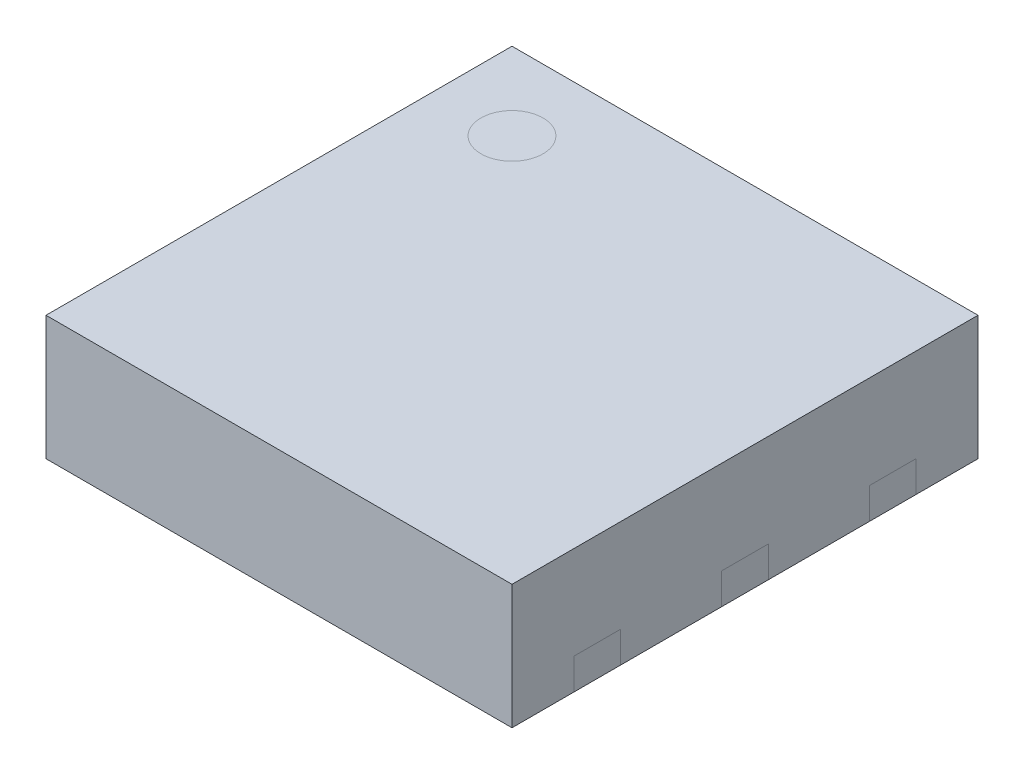
ISO-10303-21;
HEADER;
FILE_DESCRIPTION(('STEP AP214'),'2;1');
FILE_NAME('part.step','',(''),(''),'','','');
FILE_SCHEMA(('AUTOMOTIVE_DESIGN { 1 0 10303 214 1 1 1 1 }'));
ENDSEC;
DATA;
#1=APPLICATION_CONTEXT('core data for automotive mechanical design processes');
#2=APPLICATION_PROTOCOL_DEFINITION('international standard','automotive_design',2000,#1);
#3=PRODUCT_CONTEXT('',#1,'mechanical');
#4=PRODUCT('Part','Part','',(#3));
#5=PRODUCT_RELATED_PRODUCT_CATEGORY('part','',(#4));
#6=PRODUCT_DEFINITION_FORMATION('','',#4);
#7=PRODUCT_DEFINITION_CONTEXT('part definition',#1,'design');
#8=PRODUCT_DEFINITION('design','',#6,#7);
#9=PRODUCT_DEFINITION_SHAPE('','',#8);
#10=(LENGTH_UNIT() NAMED_UNIT(*) SI_UNIT(.MILLI.,.METRE.));
#11=(NAMED_UNIT(*) PLANE_ANGLE_UNIT() SI_UNIT($,.RADIAN.));
#12=(NAMED_UNIT(*) SI_UNIT($,.STERADIAN.) SOLID_ANGLE_UNIT());
#13=UNCERTAINTY_MEASURE_WITH_UNIT(LENGTH_MEASURE(1.E-05),#10,'distance_accuracy_value','');
#14=(GEOMETRIC_REPRESENTATION_CONTEXT(3) GLOBAL_UNCERTAINTY_ASSIGNED_CONTEXT((#13)) GLOBAL_UNIT_ASSIGNED_CONTEXT((#10,
#11,#12)) REPRESENTATION_CONTEXT('',''));
#15=CARTESIAN_POINT('',(0.,0.,0.));
#16=DIRECTION('',(0.,0.,1.));
#17=DIRECTION('',(1.,0.,0.));
#18=AXIS2_PLACEMENT_3D('',#15,#16,#17);
#19=CARTESIAN_POINT('',(0.,0.8,0.));
#20=DIRECTION('',(0.,1.,0.));
#21=DIRECTION('',(0.,0.,1.));
#22=AXIS2_PLACEMENT_3D('',#19,#20,#21);
#23=PLANE('',#22);
#24=DIRECTION('',(0.,0.,-1.));
#25=VECTOR('',#24,1.);
#26=CARTESIAN_POINT('',(1.5,0.8,-1.5));
#27=LINE('',#26,#25);
#28=CARTESIAN_POINT('',(1.5,0.8,1.5));
#29=VERTEX_POINT('',#28);
#30=CARTESIAN_POINT('',(1.5,0.8,-1.5));
#31=VERTEX_POINT('',#30);
#32=EDGE_CURVE('E216',#29,#31,#27,.T.);
#33=ORIENTED_EDGE('',*,*,#32,.T.);
#34=DIRECTION('',(-1.,0.,0.));
#35=VECTOR('',#34,1.);
#36=CARTESIAN_POINT('',(-1.5,0.8,-1.5));
#37=LINE('',#36,#35);
#38=CARTESIAN_POINT('',(-1.5,0.8,-1.5));
#39=VERTEX_POINT('',#38);
#40=EDGE_CURVE('E205',#31,#39,#37,.T.);
#41=ORIENTED_EDGE('',*,*,#40,.T.);
#42=DIRECTION('',(0.,0.,1.));
#43=VECTOR('',#42,1.);
#44=CARTESIAN_POINT('',(-1.5,0.8,-1.5));
#45=LINE('',#44,#43);
#46=CARTESIAN_POINT('',(-1.5,0.8,1.5));
#47=VERTEX_POINT('',#46);
#48=EDGE_CURVE('E215',#39,#47,#45,.T.);
#49=ORIENTED_EDGE('',*,*,#48,.T.);
#50=DIRECTION('',(1.,0.,0.));
#51=VECTOR('',#50,1.);
#52=CARTESIAN_POINT('',(-1.5,0.8,1.5));
#53=LINE('',#52,#51);
#54=EDGE_CURVE('E221',#47,#29,#53,.T.);
#55=ORIENTED_EDGE('',*,*,#54,.T.);
#56=EDGE_LOOP('',(#33,#41,#49,#55));
#57=FACE_BOUND('',#56,.T.);
#58=CARTESIAN_POINT('',(-1.,0.8,-1.));
#59=DIRECTION('',(0.,1.,0.));
#60=DIRECTION('',(0.,0.,1.));
#61=AXIS2_PLACEMENT_3D('',#58,#59,#60);
#62=CIRCLE('',#61,0.2);
#63=CARTESIAN_POINT('',(-1.,0.8,-0.8));
#64=VERTEX_POINT('',#63);
#65=EDGE_CURVE('E11',#64,#64,#62,.F.);
#66=ORIENTED_EDGE('',*,*,#65,.T.);
#67=EDGE_LOOP('',(#66));
#68=FACE_BOUND('',#67,.T.);
#69=ADVANCED_FACE('F43',(#57,#68),#23,.T.);
#70=CARTESIAN_POINT('',(1.5,0.8,-1.5));
#71=DIRECTION('',(-1.,0.,0.));
#72=DIRECTION('',(0.,0.,1.));
#73=AXIS2_PLACEMENT_3D('',#70,#71,#72);
#74=PLANE('',#73);
#75=DIRECTION('',(0.,-1.,0.));
#76=VECTOR('',#75,1.);
#77=CARTESIAN_POINT('',(1.5,0.8,-0.8));
#78=LINE('',#77,#76);
#79=CARTESIAN_POINT('',(1.5,0.2,-0.8));
#80=VERTEX_POINT('',#79);
#81=CARTESIAN_POINT('',(1.5,0.,-0.799999999999999));
#82=VERTEX_POINT('',#81);
#83=EDGE_CURVE('E52',#80,#82,#78,.T.);
#84=ORIENTED_EDGE('',*,*,#83,.F.);
#85=DIRECTION('',(0.,0.,1.));
#86=VECTOR('',#85,1.);
#87=CARTESIAN_POINT('',(1.5,0.2,-1.5));
#88=LINE('',#87,#86);
#89=CARTESIAN_POINT('',(1.5,0.2,-1.1));
#90=VERTEX_POINT('',#89);
#91=EDGE_CURVE('E62',#90,#80,#88,.T.);
#92=ORIENTED_EDGE('',*,*,#91,.F.);
#93=DIRECTION('',(0.,1.,0.));
#94=VECTOR('',#93,1.);
#95=CARTESIAN_POINT('',(1.5,0.8,-1.1));
#96=LINE('',#95,#94);
#97=CARTESIAN_POINT('',(1.5,0.,-1.1));
#98=VERTEX_POINT('',#97);
#99=EDGE_CURVE('E368',#98,#90,#96,.T.);
#100=ORIENTED_EDGE('',*,*,#99,.F.);
#101=DIRECTION('',(0.,0.,-1.));
#102=VECTOR('',#101,1.);
#103=CARTESIAN_POINT('',(1.5,0.,-1.5));
#104=LINE('',#103,#102);
#105=CARTESIAN_POINT('',(1.5,0.,-1.5));
#106=VERTEX_POINT('',#105);
#107=EDGE_CURVE('E229',#98,#106,#104,.T.);
#108=ORIENTED_EDGE('',*,*,#107,.T.);
#109=DIRECTION('',(0.,-1.,0.));
#110=VECTOR('',#109,1.);
#111=CARTESIAN_POINT('',(1.5,0.8,-1.5));
#112=LINE('',#111,#110);
#113=EDGE_CURVE('E209',#31,#106,#112,.T.);
#114=ORIENTED_EDGE('',*,*,#113,.F.);
#115=ORIENTED_EDGE('',*,*,#32,.F.);
#116=DIRECTION('',(0.,-1.,0.));
#117=VECTOR('',#116,1.);
#118=CARTESIAN_POINT('',(1.5,0.8,1.5));
#119=LINE('',#118,#117);
#120=CARTESIAN_POINT('',(1.5,0.,1.5));
#121=VERTEX_POINT('',#120);
#122=EDGE_CURVE('E423',#29,#121,#119,.T.);
#123=ORIENTED_EDGE('',*,*,#122,.T.);
#124=CARTESIAN_POINT('',(1.5,0.,1.1));
#125=VERTEX_POINT('',#124);
#126=EDGE_CURVE('E391',#121,#125,#104,.T.);
#127=ORIENTED_EDGE('',*,*,#126,.T.);
#128=DIRECTION('',(0.,-1.,0.));
#129=VECTOR('',#128,1.);
#130=CARTESIAN_POINT('',(1.5,0.8,1.1));
#131=LINE('',#130,#129);
#132=CARTESIAN_POINT('',(1.5,0.2,1.1));
#133=VERTEX_POINT('',#132);
#134=EDGE_CURVE('E329',#133,#125,#131,.T.);
#135=ORIENTED_EDGE('',*,*,#134,.F.);
#136=DIRECTION('',(0.,0.,1.));
#137=VECTOR('',#136,1.);
#138=CARTESIAN_POINT('',(1.5,0.199999999999999,-1.5));
#139=LINE('',#138,#137);
#140=CARTESIAN_POINT('',(1.5,0.2,0.8));
#141=VERTEX_POINT('',#140);
#142=EDGE_CURVE('E333',#141,#133,#139,.T.);
#143=ORIENTED_EDGE('',*,*,#142,.F.);
#144=DIRECTION('',(0.,1.,0.));
#145=VECTOR('',#144,1.);
#146=CARTESIAN_POINT('',(1.5,0.8,0.8));
#147=LINE('',#146,#145);
#148=CARTESIAN_POINT('',(1.5,0.,0.8));
#149=VERTEX_POINT('',#148);
#150=EDGE_CURVE('E328',#149,#141,#147,.T.);
#151=ORIENTED_EDGE('',*,*,#150,.F.);
#152=CARTESIAN_POINT('',(1.5,0.,0.15));
#153=VERTEX_POINT('',#152);
#154=EDGE_CURVE('E396',#149,#153,#104,.T.);
#155=ORIENTED_EDGE('',*,*,#154,.T.);
#156=DIRECTION('',(0.,-1.,0.));
#157=VECTOR('',#156,1.);
#158=CARTESIAN_POINT('',(1.5,0.8,0.15));
#159=LINE('',#158,#157);
#160=CARTESIAN_POINT('',(1.5,0.2,0.15));
#161=VERTEX_POINT('',#160);
#162=EDGE_CURVE('E349',#161,#153,#159,.T.);
#163=ORIENTED_EDGE('',*,*,#162,.F.);
#164=DIRECTION('',(0.,0.,1.));
#165=VECTOR('',#164,1.);
#166=CARTESIAN_POINT('',(1.5,0.2,-1.5));
#167=LINE('',#166,#165);
#168=CARTESIAN_POINT('',(1.5,0.2,-0.15));
#169=VERTEX_POINT('',#168);
#170=EDGE_CURVE('E353',#169,#161,#167,.T.);
#171=ORIENTED_EDGE('',*,*,#170,.F.);
#172=DIRECTION('',(0.,1.,0.));
#173=VECTOR('',#172,1.);
#174=CARTESIAN_POINT('',(1.5,0.8,-0.15));
#175=LINE('',#174,#173);
#176=CARTESIAN_POINT('',(1.5,0.,-0.15));
#177=VERTEX_POINT('',#176);
#178=EDGE_CURVE('E348',#177,#169,#175,.T.);
#179=ORIENTED_EDGE('',*,*,#178,.F.);
#180=EDGE_CURVE('E390',#177,#82,#104,.T.);
#181=ORIENTED_EDGE('',*,*,#180,.T.);
#182=EDGE_LOOP('',(#84,#92,#100,#108,#114,#115,#123,#127,#135,#143,#151,#155,#163,#171,#179,#181));
#183=FACE_BOUND('',#182,.T.);
#184=ADVANCED_FACE('F227',(#183),#74,.F.);
#185=CARTESIAN_POINT('',(-1.5,0.8,-1.5));
#186=DIRECTION('',(1.,0.,0.));
#187=DIRECTION('',(0.,0.,-1.));
#188=AXIS2_PLACEMENT_3D('',#185,#186,#187);
#189=PLANE('',#188);
#190=DIRECTION('',(0.,1.,0.));
#191=VECTOR('',#190,1.);
#192=CARTESIAN_POINT('',(-1.5,0.8,-0.8));
#193=LINE('',#192,#191);
#194=CARTESIAN_POINT('',(-1.5,0.,-0.8));
#195=VERTEX_POINT('',#194);
#196=CARTESIAN_POINT('',(-1.5,0.2,-0.8));
#197=VERTEX_POINT('',#196);
#198=EDGE_CURVE('E365',#195,#197,#193,.T.);
#199=ORIENTED_EDGE('',*,*,#198,.F.);
#200=DIRECTION('',(0.,0.,1.));
#201=VECTOR('',#200,1.);
#202=CARTESIAN_POINT('',(-1.5,0.,-1.5));
#203=LINE('',#202,#201);
#204=CARTESIAN_POINT('',(-1.5,0.,-0.15));
#205=VERTEX_POINT('',#204);
#206=EDGE_CURVE('E437',#195,#205,#203,.T.);
#207=ORIENTED_EDGE('',*,*,#206,.T.);
#208=DIRECTION('',(0.,-1.,0.));
#209=VECTOR('',#208,1.);
#210=CARTESIAN_POINT('',(-1.5,0.8,-0.15));
#211=LINE('',#210,#209);
#212=CARTESIAN_POINT('',(-1.5,0.2,-0.15));
#213=VERTEX_POINT('',#212);
#214=EDGE_CURVE('E332',#213,#205,#211,.T.);
#215=ORIENTED_EDGE('',*,*,#214,.F.);
#216=DIRECTION('',(0.,0.,-1.));
#217=VECTOR('',#216,1.);
#218=CARTESIAN_POINT('',(-1.5,0.2,-1.5));
#219=LINE('',#218,#217);
#220=CARTESIAN_POINT('',(-1.5,0.2,0.15));
#221=VERTEX_POINT('',#220);
#222=EDGE_CURVE('E342',#221,#213,#219,.T.);
#223=ORIENTED_EDGE('',*,*,#222,.F.);
#224=DIRECTION('',(0.,1.,0.));
#225=VECTOR('',#224,1.);
#226=CARTESIAN_POINT('',(-1.5,0.8,0.15));
#227=LINE('',#226,#225);
#228=CARTESIAN_POINT('',(-1.5,0.,0.15));
#229=VERTEX_POINT('',#228);
#230=EDGE_CURVE('E345',#229,#221,#227,.T.);
#231=ORIENTED_EDGE('',*,*,#230,.F.);
#232=CARTESIAN_POINT('',(-1.5,0.,0.8));
#233=VERTEX_POINT('',#232);
#234=EDGE_CURVE('E447',#229,#233,#203,.T.);
#235=ORIENTED_EDGE('',*,*,#234,.T.);
#236=DIRECTION('',(0.,-1.,0.));
#237=VECTOR('',#236,1.);
#238=CARTESIAN_POINT('',(-1.5,0.8,0.8));
#239=LINE('',#238,#237);
#240=CARTESIAN_POINT('',(-1.5,0.2,0.8));
#241=VERTEX_POINT('',#240);
#242=EDGE_CURVE('E313',#241,#233,#239,.T.);
#243=ORIENTED_EDGE('',*,*,#242,.F.);
#244=DIRECTION('',(0.,0.,-1.));
#245=VECTOR('',#244,1.);
#246=CARTESIAN_POINT('',(-1.5,0.199999999999999,-1.5));
#247=LINE('',#246,#245);
#248=CARTESIAN_POINT('',(-1.5,0.2,1.1));
#249=VERTEX_POINT('',#248);
#250=EDGE_CURVE('E322',#249,#241,#247,.T.);
#251=ORIENTED_EDGE('',*,*,#250,.F.);
#252=DIRECTION('',(0.,1.,0.));
#253=VECTOR('',#252,1.);
#254=CARTESIAN_POINT('',(-1.5,0.8,1.1));
#255=LINE('',#254,#253);
#256=CARTESIAN_POINT('',(-1.5,0.,1.1));
#257=VERTEX_POINT('',#256);
#258=EDGE_CURVE('E325',#257,#249,#255,.T.);
#259=ORIENTED_EDGE('',*,*,#258,.F.);
#260=CARTESIAN_POINT('',(-1.5,0.,1.5));
#261=VERTEX_POINT('',#260);
#262=EDGE_CURVE('E440',#257,#261,#203,.T.);
#263=ORIENTED_EDGE('',*,*,#262,.T.);
#264=DIRECTION('',(0.,-1.,0.));
#265=VECTOR('',#264,1.);
#266=CARTESIAN_POINT('',(-1.5,0.8,1.5));
#267=LINE('',#266,#265);
#268=EDGE_CURVE('E239',#47,#261,#267,.T.);
#269=ORIENTED_EDGE('',*,*,#268,.F.);
#270=ORIENTED_EDGE('',*,*,#48,.F.);
#271=DIRECTION('',(0.,-1.,0.));
#272=VECTOR('',#271,1.);
#273=CARTESIAN_POINT('',(-1.5,0.8,-1.5));
#274=LINE('',#273,#272);
#275=CARTESIAN_POINT('',(-1.5,0.,-1.5));
#276=VERTEX_POINT('',#275);
#277=EDGE_CURVE('E211',#39,#276,#274,.T.);
#278=ORIENTED_EDGE('',*,*,#277,.T.);
#279=CARTESIAN_POINT('',(-1.5,0.,-1.1));
#280=VERTEX_POINT('',#279);
#281=EDGE_CURVE('E433',#276,#280,#203,.T.);
#282=ORIENTED_EDGE('',*,*,#281,.T.);
#283=DIRECTION('',(0.,-1.,0.));
#284=VECTOR('',#283,1.);
#285=CARTESIAN_POINT('',(-1.5,0.8,-1.1));
#286=LINE('',#285,#284);
#287=CARTESIAN_POINT('',(-1.5,0.2,-1.1));
#288=VERTEX_POINT('',#287);
#289=EDGE_CURVE('E352',#288,#280,#286,.T.);
#290=ORIENTED_EDGE('',*,*,#289,.F.);
#291=DIRECTION('',(0.,0.,-1.));
#292=VECTOR('',#291,1.);
#293=CARTESIAN_POINT('',(-1.5,0.2,-1.5));
#294=LINE('',#293,#292);
#295=EDGE_CURVE('E362',#197,#288,#294,.T.);
#296=ORIENTED_EDGE('',*,*,#295,.F.);
#297=EDGE_LOOP('',(#199,#207,#215,#223,#231,#235,#243,#251,#259,#263,#269,#270,#278,#282,#290,#296));
#298=FACE_BOUND('',#297,.T.);
#299=ADVANCED_FACE('F472',(#298),#189,.F.);
#300=ORIENTED_EDGE('',*,*,#91,.T.);
#301=ORIENTED_EDGE('',*,*,#83,.T.);
#302=EDGE_CURVE('E378',#82,#98,#104,.T.);
#303=ORIENTED_EDGE('',*,*,#302,.T.);
#304=ORIENTED_EDGE('',*,*,#99,.T.);
#305=EDGE_LOOP('',(#300,#301,#303,#304));
#306=FACE_BOUND('',#305,.T.);
#307=ADVANCED_FACE('F376',(#306),#74,.F.);
#308=EDGE_CURVE('E436',#280,#195,#203,.T.);
#309=ORIENTED_EDGE('',*,*,#308,.T.);
#310=ORIENTED_EDGE('',*,*,#198,.T.);
#311=ORIENTED_EDGE('',*,*,#295,.T.);
#312=ORIENTED_EDGE('',*,*,#289,.T.);
#313=EDGE_LOOP('',(#309,#310,#311,#312));
#314=FACE_BOUND('',#313,.T.);
#315=ADVANCED_FACE('F463',(#314),#189,.F.);
#316=ORIENTED_EDGE('',*,*,#170,.T.);
#317=ORIENTED_EDGE('',*,*,#162,.T.);
#318=EDGE_CURVE('E402',#153,#177,#104,.T.);
#319=ORIENTED_EDGE('',*,*,#318,.T.);
#320=ORIENTED_EDGE('',*,*,#178,.T.);
#321=EDGE_LOOP('',(#316,#317,#319,#320));
#322=FACE_BOUND('',#321,.T.);
#323=ADVANCED_FACE('F498',(#322),#74,.F.);
#324=EDGE_CURVE('E442',#205,#229,#203,.T.);
#325=ORIENTED_EDGE('',*,*,#324,.T.);
#326=ORIENTED_EDGE('',*,*,#230,.T.);
#327=ORIENTED_EDGE('',*,*,#222,.T.);
#328=ORIENTED_EDGE('',*,*,#214,.T.);
#329=EDGE_LOOP('',(#325,#326,#327,#328));
#330=FACE_BOUND('',#329,.T.);
#331=ADVANCED_FACE('F477',(#330),#189,.F.);
#332=CARTESIAN_POINT('',(0.,0.,0.));
#333=DIRECTION('',(0.,1.,0.));
#334=DIRECTION('',(0.,0.,1.));
#335=AXIS2_PLACEMENT_3D('',#332,#333,#334);
#336=PLANE('',#335);
#337=DIRECTION('',(0.,0.,1.));
#338=VECTOR('',#337,1.);
#339=CARTESIAN_POINT('',(0.85,0.,0.));
#340=LINE('',#339,#338);
#341=CARTESIAN_POINT('',(0.85,0.,-1.25));
#342=VERTEX_POINT('',#341);
#343=CARTESIAN_POINT('',(0.85,0.,1.25));
#344=VERTEX_POINT('',#343);
#345=EDGE_CURVE('E251',#342,#344,#340,.T.);
#346=ORIENTED_EDGE('',*,*,#345,.F.);
#347=DIRECTION('',(1.,0.,0.));
#348=VECTOR('',#347,1.);
#349=CARTESIAN_POINT('',(0.,0.,-1.25));
#350=LINE('',#349,#348);
#351=CARTESIAN_POINT('',(-0.5,0.,-1.25));
#352=VERTEX_POINT('',#351);
#353=EDGE_CURVE('E232',#352,#342,#350,.T.);
#354=ORIENTED_EDGE('',*,*,#353,.F.);
#355=DIRECTION('',(0.707106781186551,0.,-0.707106781186544));
#356=VECTOR('',#355,1.);
#357=CARTESIAN_POINT('',(-0.874999999999997,0.,-0.875000000000007));
#358=LINE('',#357,#356);
#359=CARTESIAN_POINT('',(-0.85,0.,-0.900000000000003));
#360=VERTEX_POINT('',#359);
#361=EDGE_CURVE('E237',#360,#352,#358,.T.);
#362=ORIENTED_EDGE('',*,*,#361,.F.);
#363=DIRECTION('',(0.,0.,-1.));
#364=VECTOR('',#363,1.);
#365=CARTESIAN_POINT('',(-0.85,0.,0.));
#366=LINE('',#365,#364);
#367=CARTESIAN_POINT('',(-0.85,0.,1.25));
#368=VERTEX_POINT('',#367);
#369=EDGE_CURVE('E245',#368,#360,#366,.T.);
#370=ORIENTED_EDGE('',*,*,#369,.F.);
#371=DIRECTION('',(-1.,0.,0.));
#372=VECTOR('',#371,1.);
#373=CARTESIAN_POINT('',(0.,0.,1.25));
#374=LINE('',#373,#372);
#375=EDGE_CURVE('E248',#344,#368,#374,.T.);
#376=ORIENTED_EDGE('',*,*,#375,.F.);
#377=EDGE_LOOP('',(#346,#354,#362,#370,#376));
#378=FACE_BOUND('',#377,.T.);
#379=DIRECTION('',(1.,0.,0.));
#380=VECTOR('',#379,1.);
#381=CARTESIAN_POINT('',(0.,0.,0.8));
#382=LINE('',#381,#380);
#383=CARTESIAN_POINT('',(1.,0.,0.8));
#384=VERTEX_POINT('',#383);
#385=EDGE_CURVE('E309',#384,#149,#382,.T.);
#386=ORIENTED_EDGE('',*,*,#385,.F.);
#387=DIRECTION('',(0.,0.,-1.));
#388=VECTOR('',#387,1.);
#389=CARTESIAN_POINT('',(1.,0.,0.));
#390=LINE('',#389,#388);
#391=CARTESIAN_POINT('',(1.,0.,1.1));
#392=VERTEX_POINT('',#391);
#393=EDGE_CURVE('E308',#392,#384,#390,.T.);
#394=ORIENTED_EDGE('',*,*,#393,.F.);
#395=DIRECTION('',(-1.,0.,0.));
#396=VECTOR('',#395,1.);
#397=CARTESIAN_POINT('',(0.,0.,1.1));
#398=LINE('',#397,#396);
#399=EDGE_CURVE('E314',#125,#392,#398,.T.);
#400=ORIENTED_EDGE('',*,*,#399,.F.);
#401=ORIENTED_EDGE('',*,*,#126,.F.);
#402=DIRECTION('',(1.,0.,0.));
#403=VECTOR('',#402,1.);
#404=CARTESIAN_POINT('',(-1.5,0.,1.5));
#405=LINE('',#404,#403);
#406=EDGE_CURVE('E225',#261,#121,#405,.T.);
#407=ORIENTED_EDGE('',*,*,#406,.F.);
#408=ORIENTED_EDGE('',*,*,#262,.F.);
#409=DIRECTION('',(-1.,0.,0.));
#410=VECTOR('',#409,1.);
#411=CARTESIAN_POINT('',(0.,0.,1.1));
#412=LINE('',#411,#410);
#413=CARTESIAN_POINT('',(-1.,0.,1.1));
#414=VERTEX_POINT('',#413);
#415=EDGE_CURVE('E262',#414,#257,#412,.T.);
#416=ORIENTED_EDGE('',*,*,#415,.F.);
#417=DIRECTION('',(0.,0.,1.));
#418=VECTOR('',#417,1.);
#419=CARTESIAN_POINT('',(-1.,0.,0.));
#420=LINE('',#419,#418);
#421=CARTESIAN_POINT('',(-1.,0.,0.8));
#422=VERTEX_POINT('',#421);
#423=EDGE_CURVE('E258',#422,#414,#420,.T.);
#424=ORIENTED_EDGE('',*,*,#423,.F.);
#425=DIRECTION('',(1.,0.,0.));
#426=VECTOR('',#425,1.);
#427=CARTESIAN_POINT('',(0.,0.,0.8));
#428=LINE('',#427,#426);
#429=EDGE_CURVE('E254',#233,#422,#428,.T.);
#430=ORIENTED_EDGE('',*,*,#429,.F.);
#431=ORIENTED_EDGE('',*,*,#234,.F.);
#432=DIRECTION('',(-1.,0.,0.));
#433=VECTOR('',#432,1.);
#434=CARTESIAN_POINT('',(0.,0.,0.15));
#435=LINE('',#434,#433);
#436=CARTESIAN_POINT('',(-1.,0.,0.15));
#437=VERTEX_POINT('',#436);
#438=EDGE_CURVE('E266',#437,#229,#435,.T.);
#439=ORIENTED_EDGE('',*,*,#438,.F.);
#440=DIRECTION('',(0.,0.,1.));
#441=VECTOR('',#440,1.);
#442=CARTESIAN_POINT('',(-1.,0.,0.));
#443=LINE('',#442,#441);
#444=CARTESIAN_POINT('',(-1.,0.,-0.15));
#445=VERTEX_POINT('',#444);
#446=EDGE_CURVE('E270',#445,#437,#443,.T.);
#447=ORIENTED_EDGE('',*,*,#446,.F.);
#448=DIRECTION('',(1.,0.,0.));
#449=VECTOR('',#448,1.);
#450=CARTESIAN_POINT('',(0.,0.,-0.15));
#451=LINE('',#450,#449);
#452=EDGE_CURVE('E273',#205,#445,#451,.T.);
#453=ORIENTED_EDGE('',*,*,#452,.F.);
#454=ORIENTED_EDGE('',*,*,#206,.F.);
#455=DIRECTION('',(-1.,0.,0.));
#456=VECTOR('',#455,1.);
#457=CARTESIAN_POINT('',(0.,0.,-0.8));
#458=LINE('',#457,#456);
#459=CARTESIAN_POINT('',(-1.,0.,-0.8));
#460=VERTEX_POINT('',#459);
#461=EDGE_CURVE('E276',#460,#195,#458,.T.);
#462=ORIENTED_EDGE('',*,*,#461,.F.);
#463=DIRECTION('',(0.,0.,1.));
#464=VECTOR('',#463,1.);
#465=CARTESIAN_POINT('',(-1.,0.,0.));
#466=LINE('',#465,#464);
#467=CARTESIAN_POINT('',(-1.,0.,-1.1));
#468=VERTEX_POINT('',#467);
#469=EDGE_CURVE('E280',#468,#460,#466,.T.);
#470=ORIENTED_EDGE('',*,*,#469,.F.);
#471=DIRECTION('',(1.,0.,0.));
#472=VECTOR('',#471,1.);
#473=CARTESIAN_POINT('',(0.,0.,-1.1));
#474=LINE('',#473,#472);
#475=EDGE_CURVE('E283',#280,#468,#474,.T.);
#476=ORIENTED_EDGE('',*,*,#475,.F.);
#477=ORIENTED_EDGE('',*,*,#281,.F.);
#478=DIRECTION('',(-1.,0.,0.));
#479=VECTOR('',#478,1.);
#480=CARTESIAN_POINT('',(-1.5,0.,-1.5));
#481=LINE('',#480,#479);
#482=EDGE_CURVE('E385',#106,#276,#481,.T.);
#483=ORIENTED_EDGE('',*,*,#482,.F.);
#484=ORIENTED_EDGE('',*,*,#107,.F.);
#485=DIRECTION('',(1.,0.,0.));
#486=VECTOR('',#485,1.);
#487=CARTESIAN_POINT('',(0.,0.,-1.1));
#488=LINE('',#487,#486);
#489=CARTESIAN_POINT('',(0.999999999999999,0.,-1.1));
#490=VERTEX_POINT('',#489);
#491=EDGE_CURVE('E304',#490,#98,#488,.T.);
#492=ORIENTED_EDGE('',*,*,#491,.F.);
#493=DIRECTION('',(0.,0.,-1.));
#494=VECTOR('',#493,1.);
#495=CARTESIAN_POINT('',(0.999999999999999,0.,0.));
#496=LINE('',#495,#494);
#497=CARTESIAN_POINT('',(0.999999999999999,0.,-0.799999999999999));
#498=VERTEX_POINT('',#497);
#499=EDGE_CURVE('E297',#498,#490,#496,.T.);
#500=ORIENTED_EDGE('',*,*,#499,.F.);
#501=DIRECTION('',(-1.,0.,0.));
#502=VECTOR('',#501,1.);
#503=CARTESIAN_POINT('',(0.,0.,-0.799999999999999));
#504=LINE('',#503,#502);
#505=EDGE_CURVE('E301',#82,#498,#504,.T.);
#506=ORIENTED_EDGE('',*,*,#505,.F.);
#507=ORIENTED_EDGE('',*,*,#180,.F.);
#508=DIRECTION('',(1.,0.,0.));
#509=VECTOR('',#508,1.);
#510=CARTESIAN_POINT('',(0.,0.,-0.15));
#511=LINE('',#510,#509);
#512=CARTESIAN_POINT('',(1.,0.,-0.15));
#513=VERTEX_POINT('',#512);
#514=EDGE_CURVE('E293',#513,#177,#511,.T.);
#515=ORIENTED_EDGE('',*,*,#514,.F.);
#516=DIRECTION('',(0.,0.,-1.));
#517=VECTOR('',#516,1.);
#518=CARTESIAN_POINT('',(1.,0.,0.));
#519=LINE('',#518,#517);
#520=CARTESIAN_POINT('',(1.,0.,0.15));
#521=VERTEX_POINT('',#520);
#522=EDGE_CURVE('E286',#521,#513,#519,.T.);
#523=ORIENTED_EDGE('',*,*,#522,.F.);
#524=DIRECTION('',(-1.,0.,0.));
#525=VECTOR('',#524,1.);
#526=CARTESIAN_POINT('',(0.,0.,0.15));
#527=LINE('',#526,#525);
#528=EDGE_CURVE('E290',#153,#521,#527,.T.);
#529=ORIENTED_EDGE('',*,*,#528,.F.);
#530=ORIENTED_EDGE('',*,*,#154,.F.);
#531=EDGE_LOOP('',(#386,#394,#400,#401,#407,#408,#416,#424,#430,#431,#439,#447,#453,#454,#462,
#470,#476,#477,#483,#484,#492,#500,#506,#507,#515,#523,#529,#530));
#532=FACE_BOUND('',#531,.T.);
#533=ADVANCED_FACE('F383',(#378,#532),#336,.F.);
#534=ORIENTED_EDGE('',*,*,#393,.T.);
#535=ORIENTED_EDGE('',*,*,#385,.T.);
#536=EDGE_CURVE('E388',#125,#149,#104,.T.);
#537=ORIENTED_EDGE('',*,*,#536,.F.);
#538=ORIENTED_EDGE('',*,*,#399,.T.);
#539=EDGE_LOOP('',(#534,#535,#537,#538));
#540=FACE_BOUND('',#539,.T.);
#541=ADVANCED_FACE('F419',(#540),#336,.F.);
#542=ORIENTED_EDGE('',*,*,#499,.T.);
#543=ORIENTED_EDGE('',*,*,#491,.T.);
#544=ORIENTED_EDGE('',*,*,#302,.F.);
#545=ORIENTED_EDGE('',*,*,#505,.T.);
#546=EDGE_LOOP('',(#542,#543,#544,#545));
#547=FACE_BOUND('',#546,.T.);
#548=ADVANCED_FACE('F380',(#547),#336,.F.);
#549=ORIENTED_EDGE('',*,*,#522,.T.);
#550=ORIENTED_EDGE('',*,*,#514,.T.);
#551=ORIENTED_EDGE('',*,*,#318,.F.);
#552=ORIENTED_EDGE('',*,*,#528,.T.);
#553=EDGE_LOOP('',(#549,#550,#551,#552));
#554=FACE_BOUND('',#553,.T.);
#555=ADVANCED_FACE('F415',(#554),#336,.F.);
#556=ORIENTED_EDGE('',*,*,#308,.F.);
#557=ORIENTED_EDGE('',*,*,#475,.T.);
#558=ORIENTED_EDGE('',*,*,#469,.T.);
#559=ORIENTED_EDGE('',*,*,#461,.T.);
#560=EDGE_LOOP('',(#556,#557,#558,#559));
#561=FACE_BOUND('',#560,.T.);
#562=ADVANCED_FACE('F468',(#561),#336,.F.);
#563=ORIENTED_EDGE('',*,*,#324,.F.);
#564=ORIENTED_EDGE('',*,*,#452,.T.);
#565=ORIENTED_EDGE('',*,*,#446,.T.);
#566=ORIENTED_EDGE('',*,*,#438,.T.);
#567=EDGE_LOOP('',(#563,#564,#565,#566));
#568=FACE_BOUND('',#567,.T.);
#569=ADVANCED_FACE('F480',(#568),#336,.F.);
#570=ORIENTED_EDGE('',*,*,#423,.T.);
#571=ORIENTED_EDGE('',*,*,#415,.T.);
#572=EDGE_CURVE('E438',#233,#257,#203,.T.);
#573=ORIENTED_EDGE('',*,*,#572,.F.);
#574=ORIENTED_EDGE('',*,*,#429,.T.);
#575=EDGE_LOOP('',(#570,#571,#573,#574));
#576=FACE_BOUND('',#575,.T.);
#577=ADVANCED_FACE('F483',(#576),#336,.F.);
#578=ORIENTED_EDGE('',*,*,#142,.T.);
#579=ORIENTED_EDGE('',*,*,#134,.T.);
#580=ORIENTED_EDGE('',*,*,#536,.T.);
#581=ORIENTED_EDGE('',*,*,#150,.T.);
#582=EDGE_LOOP('',(#578,#579,#580,#581));
#583=FACE_BOUND('',#582,.T.);
#584=ADVANCED_FACE('F45',(#583),#74,.F.);
#585=CARTESIAN_POINT('',(-1.5,0.8,-1.5));
#586=DIRECTION('',(0.,0.,1.));
#587=DIRECTION('',(1.,0.,0.));
#588=AXIS2_PLACEMENT_3D('',#585,#586,#587);
#589=PLANE('',#588);
#590=ORIENTED_EDGE('',*,*,#482,.T.);
#591=ORIENTED_EDGE('',*,*,#277,.F.);
#592=ORIENTED_EDGE('',*,*,#40,.F.);
#593=ORIENTED_EDGE('',*,*,#113,.T.);
#594=EDGE_LOOP('',(#590,#591,#592,#593));
#595=FACE_BOUND('',#594,.T.);
#596=ADVANCED_FACE('F207',(#595),#589,.F.);
#597=ORIENTED_EDGE('',*,*,#572,.T.);
#598=ORIENTED_EDGE('',*,*,#258,.T.);
#599=ORIENTED_EDGE('',*,*,#250,.T.);
#600=ORIENTED_EDGE('',*,*,#242,.T.);
#601=EDGE_LOOP('',(#597,#598,#599,#600));
#602=FACE_BOUND('',#601,.T.);
#603=ADVANCED_FACE('F485',(#602),#189,.F.);
#604=CARTESIAN_POINT('',(-1.5,0.8,1.5));
#605=DIRECTION('',(0.,0.,-1.));
#606=DIRECTION('',(-1.,0.,0.));
#607=AXIS2_PLACEMENT_3D('',#604,#605,#606);
#608=PLANE('',#607);
#609=ORIENTED_EDGE('',*,*,#406,.T.);
#610=ORIENTED_EDGE('',*,*,#122,.F.);
#611=ORIENTED_EDGE('',*,*,#54,.F.);
#612=ORIENTED_EDGE('',*,*,#268,.T.);
#613=EDGE_LOOP('',(#609,#610,#611,#612));
#614=FACE_BOUND('',#613,.T.);
#615=ADVANCED_FACE('F488',(#614),#608,.F.);
#616=ORIENTED_EDGE('',*,*,#65,.F.);
#617=EDGE_LOOP('',(#616));
#618=FACE_BOUND('',#617,.T.);
#619=ADVANCED_FACE('F494',(#618),#23,.T.);
#620=ORIENTED_EDGE('',*,*,#353,.T.);
#621=ORIENTED_EDGE('',*,*,#345,.T.);
#622=ORIENTED_EDGE('',*,*,#375,.T.);
#623=ORIENTED_EDGE('',*,*,#369,.T.);
#624=ORIENTED_EDGE('',*,*,#361,.T.);
#625=EDGE_LOOP('',(#620,#621,#622,#623,#624));
#626=FACE_BOUND('',#625,.T.);
#627=ADVANCED_FACE('F506',(#626),#336,.F.);
#628=CLOSED_SHELL('',(#69,#184,#299,#307,#315,#323,#331,#533,#541,#548,#555,#562,#569,#577,#584,
#596,#603,#615,#619,#627));
#629=MANIFOLD_SOLID_BREP('B2',#628);
#630=ADVANCED_BREP_SHAPE_REPRESENTATION('',(#18,#629),#14);
#631=SHAPE_DEFINITION_REPRESENTATION(#9,#630);
ENDSEC;
END-ISO-10303-21;
